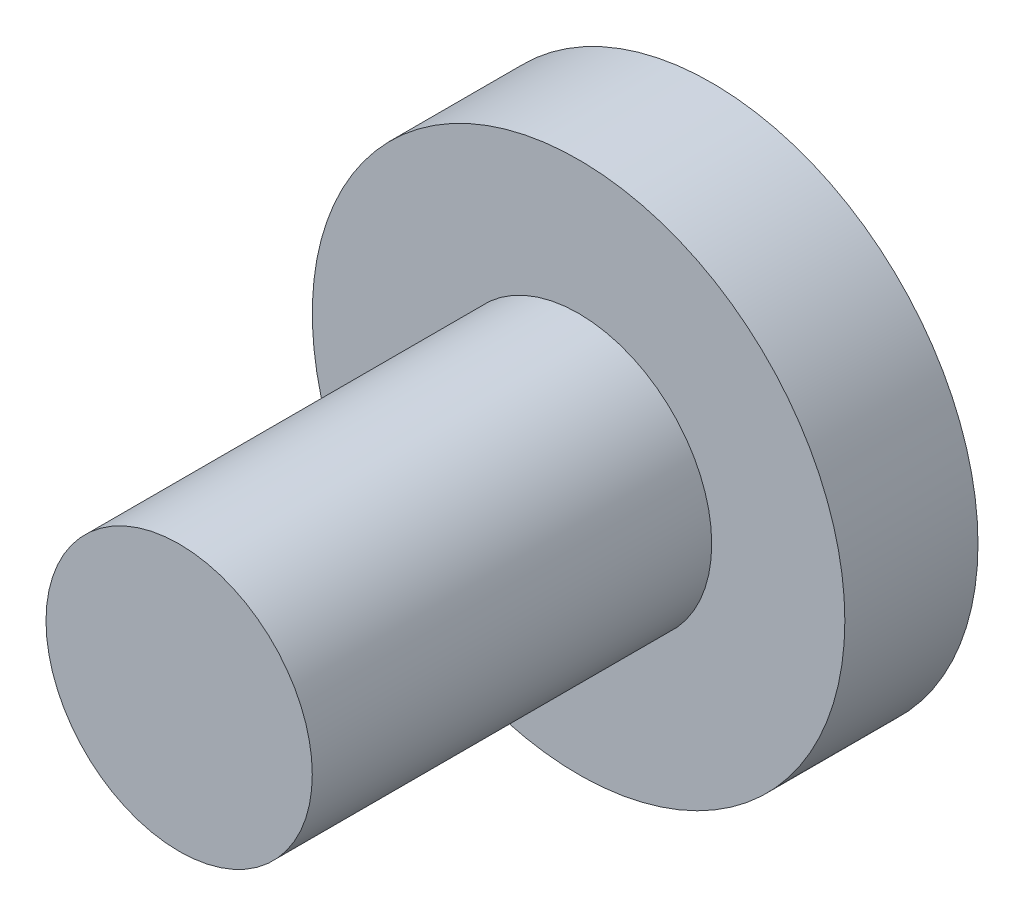
ISO-10303-21;
HEADER;
FILE_DESCRIPTION(('STEP AP214'),'2;1');
FILE_NAME('part.step','',(''),(''),'','','');
FILE_SCHEMA(('AUTOMOTIVE_DESIGN { 1 0 10303 214 1 1 1 1 }'));
ENDSEC;
DATA;
#1=APPLICATION_CONTEXT('core data for automotive mechanical design processes');
#2=APPLICATION_PROTOCOL_DEFINITION('international standard','automotive_design',2000,#1);
#3=PRODUCT_CONTEXT('',#1,'mechanical');
#4=PRODUCT('Part','Part','',(#3));
#5=PRODUCT_RELATED_PRODUCT_CATEGORY('part','',(#4));
#6=PRODUCT_DEFINITION_FORMATION('','',#4);
#7=PRODUCT_DEFINITION_CONTEXT('part definition',#1,'design');
#8=PRODUCT_DEFINITION('design','',#6,#7);
#9=PRODUCT_DEFINITION_SHAPE('','',#8);
#10=(LENGTH_UNIT() NAMED_UNIT(*) SI_UNIT(.MILLI.,.METRE.));
#11=(NAMED_UNIT(*) PLANE_ANGLE_UNIT() SI_UNIT($,.RADIAN.));
#12=(NAMED_UNIT(*) SI_UNIT($,.STERADIAN.) SOLID_ANGLE_UNIT());
#13=UNCERTAINTY_MEASURE_WITH_UNIT(LENGTH_MEASURE(1.E-05),#10,'distance_accuracy_value','');
#14=(GEOMETRIC_REPRESENTATION_CONTEXT(3) GLOBAL_UNCERTAINTY_ASSIGNED_CONTEXT((#13)) GLOBAL_UNIT_ASSIGNED_CONTEXT((#10,
#11,#12)) REPRESENTATION_CONTEXT('',''));
#15=CARTESIAN_POINT('',(0.,0.,0.));
#16=DIRECTION('',(0.,0.,1.));
#17=DIRECTION('',(1.,0.,0.));
#18=AXIS2_PLACEMENT_3D('',#15,#16,#17);
#19=CARTESIAN_POINT('',(0.,0.,5.));
#20=DIRECTION('',(0.,0.,-1.));
#21=DIRECTION('',(-1.,0.,0.));
#22=AXIS2_PLACEMENT_3D('',#19,#20,#21);
#23=CYLINDRICAL_SURFACE('',#22,10.);
#24=CARTESIAN_POINT('',(0.,0.,5.));
#25=DIRECTION('',(0.,0.,1.));
#26=DIRECTION('',(1.,0.,0.));
#27=AXIS2_PLACEMENT_3D('',#24,#25,#26);
#28=CIRCLE('',#27,10.);
#29=CARTESIAN_POINT('',(10.,0.,5.));
#30=VERTEX_POINT('',#29);
#31=EDGE_CURVE('E38',#30,#30,#28,.T.);
#32=ORIENTED_EDGE('',*,*,#31,.F.);
#33=EDGE_LOOP('',(#32));
#34=FACE_BOUND('',#33,.T.);
#35=CARTESIAN_POINT('',(0.,0.,0.));
#36=DIRECTION('',(0.,0.,1.));
#37=DIRECTION('',(1.,0.,0.));
#38=AXIS2_PLACEMENT_3D('',#35,#36,#37);
#39=CIRCLE('',#38,10.);
#40=CARTESIAN_POINT('',(10.,0.,0.));
#41=VERTEX_POINT('',#40);
#42=EDGE_CURVE('E34',#41,#41,#39,.T.);
#43=ORIENTED_EDGE('',*,*,#42,.T.);
#44=EDGE_LOOP('',(#43));
#45=FACE_BOUND('',#44,.T.);
#46=ADVANCED_FACE('F31',(#34,#45),#23,.T.);
#47=CARTESIAN_POINT('',(0.,0.,5.));
#48=DIRECTION('',(0.,0.,1.));
#49=DIRECTION('',(1.,0.,0.));
#50=AXIS2_PLACEMENT_3D('',#47,#48,#49);
#51=PLANE('',#50);
#52=CARTESIAN_POINT('',(0.,0.,5.));
#53=DIRECTION('',(0.,0.,1.));
#54=DIRECTION('',(1.,0.,0.));
#55=AXIS2_PLACEMENT_3D('',#52,#53,#54);
#56=CIRCLE('',#55,5.);
#57=CARTESIAN_POINT('',(5.,0.,5.));
#58=VERTEX_POINT('',#57);
#59=EDGE_CURVE('E10',#58,#58,#56,.T.);
#60=ORIENTED_EDGE('',*,*,#59,.F.);
#61=EDGE_LOOP('',(#60));
#62=FACE_BOUND('',#61,.T.);
#63=ORIENTED_EDGE('',*,*,#31,.T.);
#64=EDGE_LOOP('',(#63));
#65=FACE_BOUND('',#64,.T.);
#66=ADVANCED_FACE('F55',(#62,#65),#51,.T.);
#67=CARTESIAN_POINT('',(0.,0.,0.));
#68=DIRECTION('',(0.,0.,1.));
#69=DIRECTION('',(1.,0.,0.));
#70=AXIS2_PLACEMENT_3D('',#67,#68,#69);
#71=PLANE('',#70);
#72=ORIENTED_EDGE('',*,*,#42,.F.);
#73=EDGE_LOOP('',(#72));
#74=FACE_BOUND('',#73,.T.);
#75=ADVANCED_FACE('F52',(#74),#71,.F.);
#76=CARTESIAN_POINT('',(0.,0.,20.));
#77=DIRECTION('',(0.,0.,-1.));
#78=DIRECTION('',(-1.,0.,0.));
#79=AXIS2_PLACEMENT_3D('',#76,#77,#78);
#80=CYLINDRICAL_SURFACE('',#79,5.);
#81=CARTESIAN_POINT('',(0.,0.,20.));
#82=DIRECTION('',(0.,0.,1.));
#83=DIRECTION('',(1.,0.,0.));
#84=AXIS2_PLACEMENT_3D('',#81,#82,#83);
#85=CIRCLE('',#84,5.);
#86=CARTESIAN_POINT('',(5.,0.,20.));
#87=VERTEX_POINT('',#86);
#88=EDGE_CURVE('E44',#87,#87,#85,.T.);
#89=ORIENTED_EDGE('',*,*,#88,.F.);
#90=EDGE_LOOP('',(#89));
#91=FACE_BOUND('',#90,.T.);
#92=ORIENTED_EDGE('',*,*,#59,.T.);
#93=EDGE_LOOP('',(#92));
#94=FACE_BOUND('',#93,.T.);
#95=ADVANCED_FACE('F54',(#91,#94),#80,.T.);
#96=CARTESIAN_POINT('',(0.,0.,20.));
#97=DIRECTION('',(0.,0.,1.));
#98=DIRECTION('',(1.,0.,0.));
#99=AXIS2_PLACEMENT_3D('',#96,#97,#98);
#100=PLANE('',#99);
#101=ORIENTED_EDGE('',*,*,#88,.T.);
#102=EDGE_LOOP('',(#101));
#103=FACE_BOUND('',#102,.T.);
#104=ADVANCED_FACE('F60',(#103),#100,.T.);
#105=CLOSED_SHELL('',(#46,#66,#75,#95,#104));
#106=MANIFOLD_SOLID_BREP('B2',#105);
#107=ADVANCED_BREP_SHAPE_REPRESENTATION('',(#18,#106),#14);
#108=SHAPE_DEFINITION_REPRESENTATION(#9,#107);
ENDSEC;
END-ISO-10303-21;
